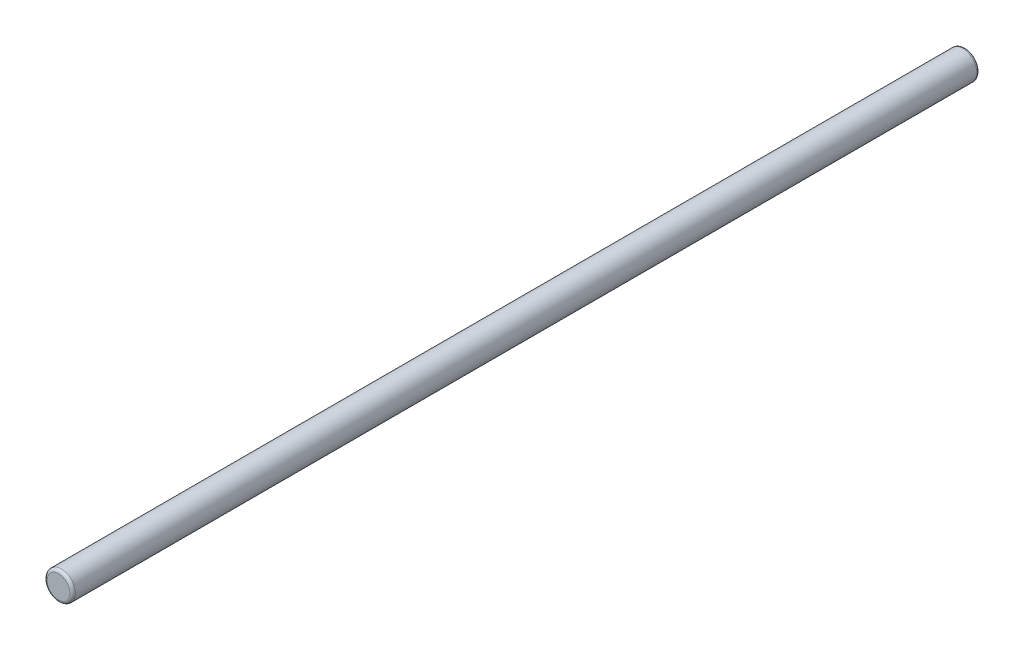
ISO-10303-21;
HEADER;
FILE_DESCRIPTION(('STEP AP214'),'2;1');
FILE_NAME('part.step','',(''),(''),'','','');
FILE_SCHEMA(('AUTOMOTIVE_DESIGN { 1 0 10303 214 1 1 1 1 }'));
ENDSEC;
DATA;
#1=APPLICATION_CONTEXT('core data for automotive mechanical design processes');
#2=APPLICATION_PROTOCOL_DEFINITION('international standard','automotive_design',2000,#1);
#3=PRODUCT_CONTEXT('',#1,'mechanical');
#4=PRODUCT('Part','Part','',(#3));
#5=PRODUCT_RELATED_PRODUCT_CATEGORY('part','',(#4));
#6=PRODUCT_DEFINITION_FORMATION('','',#4);
#7=PRODUCT_DEFINITION_CONTEXT('part definition',#1,'design');
#8=PRODUCT_DEFINITION('design','',#6,#7);
#9=PRODUCT_DEFINITION_SHAPE('','',#8);
#10=(LENGTH_UNIT() NAMED_UNIT(*) SI_UNIT(.MILLI.,.METRE.));
#11=(NAMED_UNIT(*) PLANE_ANGLE_UNIT() SI_UNIT($,.RADIAN.));
#12=(NAMED_UNIT(*) SI_UNIT($,.STERADIAN.) SOLID_ANGLE_UNIT());
#13=UNCERTAINTY_MEASURE_WITH_UNIT(LENGTH_MEASURE(1.E-05),#10,'distance_accuracy_value','');
#14=(GEOMETRIC_REPRESENTATION_CONTEXT(3) GLOBAL_UNCERTAINTY_ASSIGNED_CONTEXT((#13)) GLOBAL_UNIT_ASSIGNED_CONTEXT((#10,
#11,#12)) REPRESENTATION_CONTEXT('',''));
#15=CARTESIAN_POINT('',(0.,0.,0.));
#16=DIRECTION('',(0.,0.,1.));
#17=DIRECTION('',(1.,0.,0.));
#18=AXIS2_PLACEMENT_3D('',#15,#16,#17);
#19=CARTESIAN_POINT('',(0.,0.,80.));
#20=DIRECTION('',(0.,0.,-1.));
#21=DIRECTION('',(-1.,0.,0.));
#22=AXIS2_PLACEMENT_3D('',#19,#20,#21);
#23=CYLINDRICAL_SURFACE('',#22,1.25);
#24=CARTESIAN_POINT('',(0.,0.,79.75));
#25=DIRECTION('',(0.,0.,1.));
#26=DIRECTION('',(1.,0.,0.));
#27=AXIS2_PLACEMENT_3D('',#24,#25,#26);
#28=CIRCLE('',#27,1.25);
#29=CARTESIAN_POINT('',(1.25,0.,79.75));
#30=VERTEX_POINT('',#29);
#31=EDGE_CURVE('E43',#30,#30,#28,.F.);
#32=ORIENTED_EDGE('',*,*,#31,.T.);
#33=EDGE_LOOP('',(#32));
#34=FACE_BOUND('',#33,.T.);
#35=CARTESIAN_POINT('',(0.,0.,0.25));
#36=DIRECTION('',(0.,0.,1.));
#37=DIRECTION('',(1.,0.,0.));
#38=AXIS2_PLACEMENT_3D('',#35,#36,#37);
#39=CIRCLE('',#38,1.25);
#40=CARTESIAN_POINT('',(1.25,0.,0.25));
#41=VERTEX_POINT('',#40);
#42=EDGE_CURVE('E47',#41,#41,#39,.T.);
#43=ORIENTED_EDGE('',*,*,#42,.T.);
#44=EDGE_LOOP('',(#43));
#45=FACE_BOUND('',#44,.T.);
#46=ADVANCED_FACE('F36',(#34,#45),#23,.T.);
#47=CARTESIAN_POINT('',(0.,0.,80.));
#48=DIRECTION('',(0.,0.,1.));
#49=DIRECTION('',(1.,0.,0.));
#50=AXIS2_PLACEMENT_3D('',#47,#48,#49);
#51=PLANE('',#50);
#52=CARTESIAN_POINT('',(0.,0.,80.));
#53=DIRECTION('',(0.,0.,1.));
#54=DIRECTION('',(1.,0.,0.));
#55=AXIS2_PLACEMENT_3D('',#52,#53,#54);
#56=CIRCLE('',#55,1.);
#57=CARTESIAN_POINT('',(1.,0.,80.));
#58=VERTEX_POINT('',#57);
#59=EDGE_CURVE('E51',#58,#58,#56,.T.);
#60=ORIENTED_EDGE('',*,*,#59,.T.);
#61=EDGE_LOOP('',(#60));
#62=FACE_BOUND('',#61,.T.);
#63=ADVANCED_FACE('F57',(#62),#51,.T.);
#64=CARTESIAN_POINT('',(0.,0.,0.));
#65=DIRECTION('',(0.,0.,1.));
#66=DIRECTION('',(1.,0.,0.));
#67=AXIS2_PLACEMENT_3D('',#64,#65,#66);
#68=PLANE('',#67);
#69=CARTESIAN_POINT('',(0.,0.,0.));
#70=DIRECTION('',(0.,0.,1.));
#71=DIRECTION('',(1.,0.,0.));
#72=AXIS2_PLACEMENT_3D('',#69,#70,#71);
#73=CIRCLE('',#72,1.);
#74=CARTESIAN_POINT('',(1.,0.,0.));
#75=VERTEX_POINT('',#74);
#76=EDGE_CURVE('E10',#75,#75,#73,.F.);
#77=ORIENTED_EDGE('',*,*,#76,.T.);
#78=EDGE_LOOP('',(#77));
#79=FACE_BOUND('',#78,.T.);
#80=ADVANCED_FACE('F61',(#79),#68,.F.);
#81=CARTESIAN_POINT('',(0.,0.,79.75));
#82=DIRECTION('',(0.,0.,1.));
#83=DIRECTION('',(1.,0.,0.));
#84=AXIS2_PLACEMENT_3D('',#81,#82,#83);
#85=TOROIDAL_SURFACE('',#84,1.,0.25);
#86=ORIENTED_EDGE('',*,*,#31,.F.);
#87=EDGE_LOOP('',(#86));
#88=FACE_BOUND('',#87,.T.);
#89=ORIENTED_EDGE('',*,*,#59,.F.);
#90=EDGE_LOOP('',(#89));
#91=FACE_BOUND('',#90,.T.);
#92=ADVANCED_FACE('F59',(#88,#91),#85,.T.);
#93=CARTESIAN_POINT('',(0.,0.,0.25));
#94=DIRECTION('',(0.,0.,1.));
#95=DIRECTION('',(1.,0.,0.));
#96=AXIS2_PLACEMENT_3D('',#93,#94,#95);
#97=TOROIDAL_SURFACE('',#96,1.,0.25);
#98=ORIENTED_EDGE('',*,*,#76,.F.);
#99=EDGE_LOOP('',(#98));
#100=FACE_BOUND('',#99,.T.);
#101=ORIENTED_EDGE('',*,*,#42,.F.);
#102=EDGE_LOOP('',(#101));
#103=FACE_BOUND('',#102,.T.);
#104=ADVANCED_FACE('F38',(#100,#103),#97,.T.);
#105=CLOSED_SHELL('',(#46,#63,#80,#92,#104));
#106=MANIFOLD_SOLID_BREP('B2',#105);
#107=ADVANCED_BREP_SHAPE_REPRESENTATION('',(#18,#106),#14);
#108=SHAPE_DEFINITION_REPRESENTATION(#9,#107);
ENDSEC;
END-ISO-10303-21;
